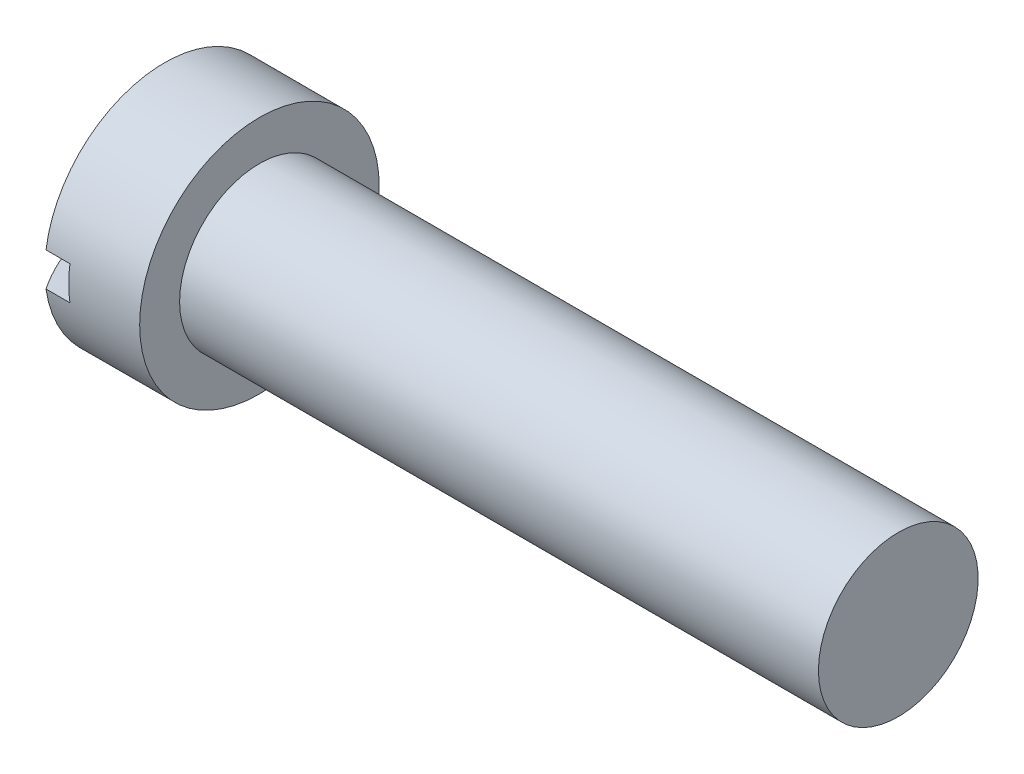
ISO-10303-21;
HEADER;
FILE_DESCRIPTION(('STEP AP214'),'2;1');
FILE_NAME('part.step','',(''),(''),'','','');
FILE_SCHEMA(('AUTOMOTIVE_DESIGN { 1 0 10303 214 1 1 1 1 }'));
ENDSEC;
DATA;
#1=APPLICATION_CONTEXT('core data for automotive mechanical design processes');
#2=APPLICATION_PROTOCOL_DEFINITION('international standard','automotive_design',2000,#1);
#3=PRODUCT_CONTEXT('',#1,'mechanical');
#4=PRODUCT('Part','Part','',(#3));
#5=PRODUCT_RELATED_PRODUCT_CATEGORY('part','',(#4));
#6=PRODUCT_DEFINITION_FORMATION('','',#4);
#7=PRODUCT_DEFINITION_CONTEXT('part definition',#1,'design');
#8=PRODUCT_DEFINITION('design','',#6,#7);
#9=PRODUCT_DEFINITION_SHAPE('','',#8);
#10=(LENGTH_UNIT() NAMED_UNIT(*) SI_UNIT(.MILLI.,.METRE.));
#11=(NAMED_UNIT(*) PLANE_ANGLE_UNIT() SI_UNIT($,.RADIAN.));
#12=(NAMED_UNIT(*) SI_UNIT($,.STERADIAN.) SOLID_ANGLE_UNIT());
#13=UNCERTAINTY_MEASURE_WITH_UNIT(LENGTH_MEASURE(1.E-05),#10,'distance_accuracy_value','');
#14=(GEOMETRIC_REPRESENTATION_CONTEXT(3) GLOBAL_UNCERTAINTY_ASSIGNED_CONTEXT((#13)) GLOBAL_UNIT_ASSIGNED_CONTEXT((#10,
#11,#12)) REPRESENTATION_CONTEXT('',''));
#15=CARTESIAN_POINT('',(0.,0.,0.));
#16=DIRECTION('',(0.,0.,1.));
#17=DIRECTION('',(1.,0.,0.));
#18=AXIS2_PLACEMENT_3D('',#15,#16,#17);
#19=CARTESIAN_POINT('',(16.9903913043478,0.,0.));
#20=DIRECTION('',(-1.,0.,0.));
#21=DIRECTION('',(0.,-1.,0.));
#22=AXIS2_PLACEMENT_3D('',#19,#20,#21);
#23=SPHERICAL_SURFACE('',#22,16.9903913043478);
#24=CARTESIAN_POINT('',(2.921,0.,0.));
#25=DIRECTION('',(-1.,0.,0.));
#26=DIRECTION('',(0.,0.,1.));
#27=AXIS2_PLACEMENT_3D('',#24,#25,#26);
#28=CIRCLE('',#27,9.525);
#29=CARTESIAN_POINT('',(2.921,-1.3462,-9.42938866311067));
#30=VERTEX_POINT('',#29);
#31=CARTESIAN_POINT('',(2.921,-1.3462,9.42938866311067));
#32=VERTEX_POINT('',#31);
#33=EDGE_CURVE('E88',#30,#32,#28,.T.);
#34=ORIENTED_EDGE('',*,*,#33,.T.);
#35=CARTESIAN_POINT('',(16.9903913043478,-1.3462,0.));
#36=DIRECTION('',(0.,1.,0.));
#37=DIRECTION('',(0.,0.,1.));
#38=AXIS2_PLACEMENT_3D('',#35,#36,#37);
#39=CIRCLE('',#38,16.9369755929109);
#40=EDGE_CURVE('E112',#32,#30,#39,.F.);
#41=ORIENTED_EDGE('',*,*,#40,.T.);
#42=EDGE_LOOP('',(#34,#41));
#43=FACE_BOUND('',#42,.T.);
#44=ADVANCED_FACE('F34',(#43),#23,.T.);
#45=CARTESIAN_POINT('',(2.921,1.3462,9.42938866311067));
#46=VERTEX_POINT('',#45);
#47=CARTESIAN_POINT('',(2.921,1.3462,-9.42938866311067));
#48=VERTEX_POINT('',#47);
#49=EDGE_CURVE('E90',#46,#48,#28,.T.);
#50=ORIENTED_EDGE('',*,*,#49,.T.);
#51=CARTESIAN_POINT('',(16.9903913043478,1.3462,0.));
#52=DIRECTION('',(0.,-1.,0.));
#53=DIRECTION('',(0.,0.,-1.));
#54=AXIS2_PLACEMENT_3D('',#51,#52,#53);
#55=CIRCLE('',#54,16.9369755929109);
#56=EDGE_CURVE('E108',#48,#46,#55,.F.);
#57=ORIENTED_EDGE('',*,*,#56,.T.);
#58=EDGE_LOOP('',(#50,#57));
#59=FACE_BOUND('',#58,.T.);
#60=ADVANCED_FACE('F111',(#59),#23,.T.);
#61=CARTESIAN_POINT('',(-25.4,0.,0.));
#62=DIRECTION('',(-1.,0.,0.));
#63=DIRECTION('',(0.,0.,1.));
#64=AXIS2_PLACEMENT_3D('',#61,#62,#63);
#65=CYLINDRICAL_SURFACE('',#64,9.525);
#66=CARTESIAN_POINT('',(10.4648,0.,0.));
#67=DIRECTION('',(-1.,0.,0.));
#68=DIRECTION('',(0.,0.,1.));
#69=AXIS2_PLACEMENT_3D('',#66,#67,#68);
#70=CIRCLE('',#69,9.525);
#71=CARTESIAN_POINT('',(10.4648,0.,9.525));
#72=VERTEX_POINT('',#71);
#73=EDGE_CURVE('E91',#72,#72,#70,.T.);
#74=ORIENTED_EDGE('',*,*,#73,.T.);
#75=EDGE_LOOP('',(#74));
#76=FACE_BOUND('',#75,.T.);
#77=DIRECTION('',(-1.,0.,0.));
#78=VECTOR('',#77,1.);
#79=CARTESIAN_POINT('',(-25.4,-1.3462,-9.42938866311067));
#80=LINE('',#79,#78);
#81=CARTESIAN_POINT('',(4.826,-1.3462,-9.42938866311067));
#82=VERTEX_POINT('',#81);
#83=EDGE_CURVE('E11',#82,#30,#80,.T.);
#84=ORIENTED_EDGE('',*,*,#83,.F.);
#85=CARTESIAN_POINT('',(4.826,0.,0.));
#86=DIRECTION('',(-1.,0.,0.));
#87=DIRECTION('',(0.,0.,1.));
#88=AXIS2_PLACEMENT_3D('',#85,#86,#87);
#89=CIRCLE('',#88,9.525);
#90=CARTESIAN_POINT('',(4.826,1.3462,-9.42938866311067));
#91=VERTEX_POINT('',#90);
#92=EDGE_CURVE('E71',#91,#82,#89,.T.);
#93=ORIENTED_EDGE('',*,*,#92,.F.);
#94=DIRECTION('',(-1.,0.,0.));
#95=VECTOR('',#94,1.);
#96=CARTESIAN_POINT('',(-25.4,1.3462,-9.42938866311067));
#97=LINE('',#96,#95);
#98=EDGE_CURVE('E42',#48,#91,#97,.F.);
#99=ORIENTED_EDGE('',*,*,#98,.F.);
#100=ORIENTED_EDGE('',*,*,#49,.F.);
#101=DIRECTION('',(-1.,0.,0.));
#102=VECTOR('',#101,1.);
#103=CARTESIAN_POINT('',(-25.4,1.3462,9.42938866311067));
#104=LINE('',#103,#102);
#105=CARTESIAN_POINT('',(4.826,1.3462,9.42938866311067));
#106=VERTEX_POINT('',#105);
#107=EDGE_CURVE('E102',#106,#46,#104,.T.);
#108=ORIENTED_EDGE('',*,*,#107,.F.);
#109=CARTESIAN_POINT('',(4.826,-1.3462,9.42938866311067));
#110=VERTEX_POINT('',#109);
#111=EDGE_CURVE('E80',#110,#106,#89,.T.);
#112=ORIENTED_EDGE('',*,*,#111,.F.);
#113=DIRECTION('',(-1.,0.,0.));
#114=VECTOR('',#113,1.);
#115=CARTESIAN_POINT('',(-25.4,-1.3462,9.42938866311067));
#116=LINE('',#115,#114);
#117=EDGE_CURVE('E78',#32,#110,#116,.F.);
#118=ORIENTED_EDGE('',*,*,#117,.F.);
#119=ORIENTED_EDGE('',*,*,#33,.F.);
#120=EDGE_LOOP('',(#84,#93,#99,#100,#108,#112,#118,#119));
#121=FACE_BOUND('',#120,.T.);
#122=ADVANCED_FACE('F86',(#76,#121),#65,.T.);
#123=CARTESIAN_POINT('',(-25.4,0.,0.));
#124=DIRECTION('',(-1.,0.,0.));
#125=DIRECTION('',(0.,0.,1.));
#126=AXIS2_PLACEMENT_3D('',#123,#124,#125);
#127=CYLINDRICAL_SURFACE('',#126,6.35);
#128=CARTESIAN_POINT('',(61.2648,0.,0.));
#129=DIRECTION('',(-1.,0.,0.));
#130=DIRECTION('',(0.,0.,1.));
#131=AXIS2_PLACEMENT_3D('',#128,#129,#130);
#132=CIRCLE('',#131,6.35);
#133=CARTESIAN_POINT('',(61.2648,0.,6.35));
#134=VERTEX_POINT('',#133);
#135=EDGE_CURVE('E94',#134,#134,#132,.T.);
#136=ORIENTED_EDGE('',*,*,#135,.T.);
#137=EDGE_LOOP('',(#136));
#138=FACE_BOUND('',#137,.T.);
#139=CARTESIAN_POINT('',(10.4648,0.,0.));
#140=DIRECTION('',(-1.,0.,0.));
#141=DIRECTION('',(0.,0.,1.));
#142=AXIS2_PLACEMENT_3D('',#139,#140,#141);
#143=CIRCLE('',#142,6.35);
#144=CARTESIAN_POINT('',(10.4648,0.,6.35));
#145=VERTEX_POINT('',#144);
#146=EDGE_CURVE('E96',#145,#145,#143,.T.);
#147=ORIENTED_EDGE('',*,*,#146,.F.);
#148=EDGE_LOOP('',(#147));
#149=FACE_BOUND('',#148,.T.);
#150=ADVANCED_FACE('F36',(#138,#149),#127,.T.);
#151=CARTESIAN_POINT('',(61.2648,6.35,0.));
#152=DIRECTION('',(1.,0.,0.));
#153=DIRECTION('',(0.,0.,-1.));
#154=AXIS2_PLACEMENT_3D('',#151,#152,#153);
#155=PLANE('',#154);
#156=ORIENTED_EDGE('',*,*,#135,.F.);
#157=EDGE_LOOP('',(#156));
#158=FACE_BOUND('',#157,.T.);
#159=ADVANCED_FACE('F122',(#158),#155,.T.);
#160=CARTESIAN_POINT('',(10.4648,6.35,0.));
#161=DIRECTION('',(-1.,0.,0.));
#162=DIRECTION('',(0.,0.,1.));
#163=AXIS2_PLACEMENT_3D('',#160,#161,#162);
#164=PLANE('',#163);
#165=ORIENTED_EDGE('',*,*,#73,.F.);
#166=EDGE_LOOP('',(#165));
#167=FACE_BOUND('',#166,.T.);
#168=ORIENTED_EDGE('',*,*,#146,.T.);
#169=EDGE_LOOP('',(#168));
#170=FACE_BOUND('',#169,.T.);
#171=ADVANCED_FACE('F119',(#167,#170),#164,.F.);
#172=CARTESIAN_POINT('',(4.826,-1.3462,-9.525));
#173=DIRECTION('',(0.,1.,0.));
#174=DIRECTION('',(0.,0.,1.));
#175=AXIS2_PLACEMENT_3D('',#172,#173,#174);
#176=PLANE('',#175);
#177=ORIENTED_EDGE('',*,*,#83,.T.);
#178=ORIENTED_EDGE('',*,*,#40,.F.);
#179=ORIENTED_EDGE('',*,*,#117,.T.);
#180=DIRECTION('',(0.,0.,-1.));
#181=VECTOR('',#180,1.);
#182=CARTESIAN_POINT('',(4.826,-1.3462,-9.525));
#183=LINE('',#182,#181);
#184=EDGE_CURVE('E49',#110,#82,#183,.T.);
#185=ORIENTED_EDGE('',*,*,#184,.T.);
#186=EDGE_LOOP('',(#177,#178,#179,#185));
#187=FACE_BOUND('',#186,.T.);
#188=ADVANCED_FACE('F81',(#187),#176,.T.);
#189=CARTESIAN_POINT('',(4.826,1.3462,9.525));
#190=DIRECTION('',(0.,-1.,0.));
#191=DIRECTION('',(0.,0.,-1.));
#192=AXIS2_PLACEMENT_3D('',#189,#190,#191);
#193=PLANE('',#192);
#194=ORIENTED_EDGE('',*,*,#107,.T.);
#195=ORIENTED_EDGE('',*,*,#56,.F.);
#196=ORIENTED_EDGE('',*,*,#98,.T.);
#197=DIRECTION('',(0.,0.,1.));
#198=VECTOR('',#197,1.);
#199=CARTESIAN_POINT('',(4.826,1.3462,9.525));
#200=LINE('',#199,#198);
#201=EDGE_CURVE('E74',#91,#106,#200,.T.);
#202=ORIENTED_EDGE('',*,*,#201,.T.);
#203=EDGE_LOOP('',(#194,#195,#196,#202));
#204=FACE_BOUND('',#203,.T.);
#205=ADVANCED_FACE('F105',(#204),#193,.T.);
#206=CARTESIAN_POINT('',(4.826,-1.3462,9.525));
#207=DIRECTION('',(-1.,0.,0.));
#208=DIRECTION('',(0.,0.,1.));
#209=AXIS2_PLACEMENT_3D('',#206,#207,#208);
#210=PLANE('',#209);
#211=ORIENTED_EDGE('',*,*,#201,.F.);
#212=ORIENTED_EDGE('',*,*,#92,.T.);
#213=ORIENTED_EDGE('',*,*,#184,.F.);
#214=ORIENTED_EDGE('',*,*,#111,.T.);
#215=EDGE_LOOP('',(#211,#212,#213,#214));
#216=FACE_BOUND('',#215,.T.);
#217=ADVANCED_FACE('F72',(#216),#210,.T.);
#218=CLOSED_SHELL('',(#44,#60,#122,#150,#159,#171,#188,#205,#217));
#219=MANIFOLD_SOLID_BREP('B2',#218);
#220=ADVANCED_BREP_SHAPE_REPRESENTATION('',(#18,#219),#14);
#221=SHAPE_DEFINITION_REPRESENTATION(#9,#220);
ENDSEC;
END-ISO-10303-21;
